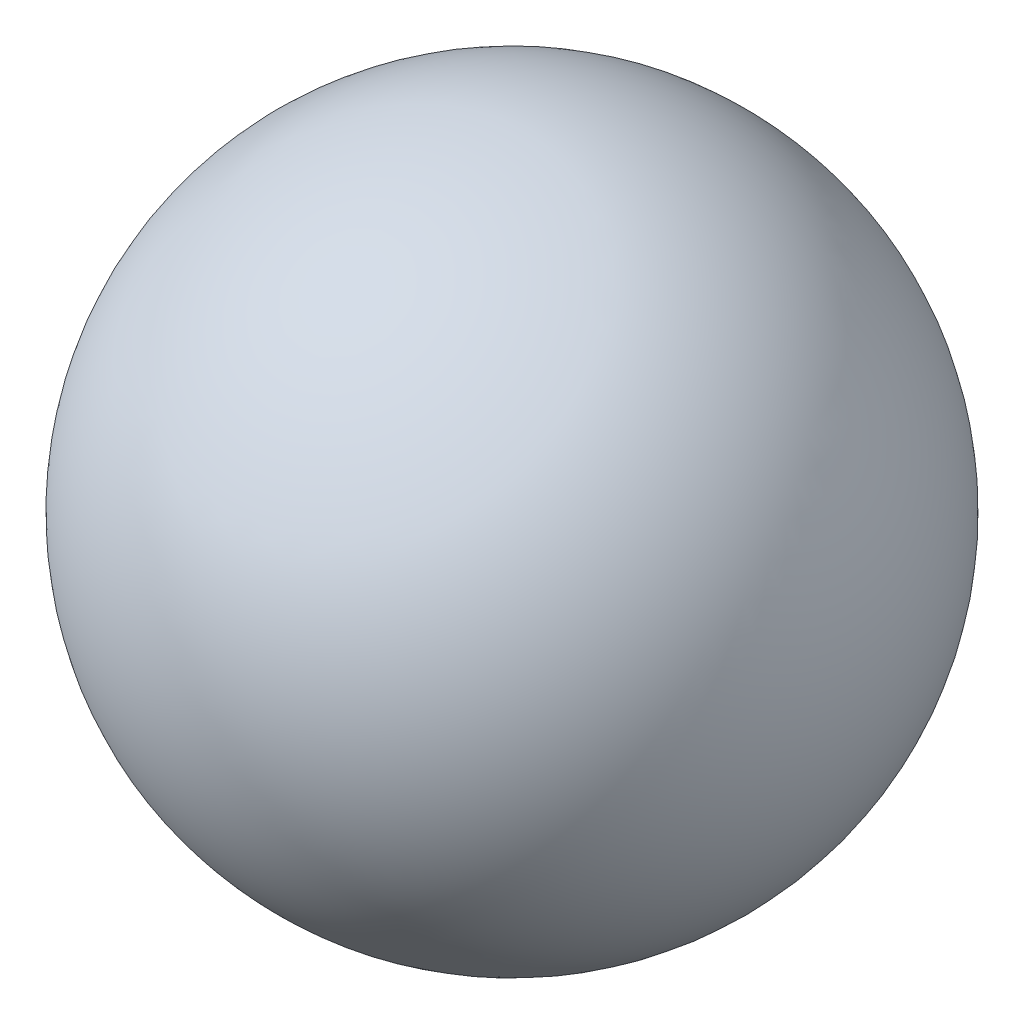
ISO-10303-21;
HEADER;
FILE_DESCRIPTION(('STEP AP214'),'2;1');
FILE_NAME('part.step','',(''),(''),'','','');
FILE_SCHEMA(('AUTOMOTIVE_DESIGN { 1 0 10303 214 1 1 1 1 }'));
ENDSEC;
DATA;
#1=APPLICATION_CONTEXT('core data for automotive mechanical design processes');
#2=APPLICATION_PROTOCOL_DEFINITION('international standard','automotive_design',2000,#1);
#3=PRODUCT_CONTEXT('',#1,'mechanical');
#4=PRODUCT('Part','Part','',(#3));
#5=PRODUCT_RELATED_PRODUCT_CATEGORY('part','',(#4));
#6=PRODUCT_DEFINITION_FORMATION('','',#4);
#7=PRODUCT_DEFINITION_CONTEXT('part definition',#1,'design');
#8=PRODUCT_DEFINITION('design','',#6,#7);
#9=PRODUCT_DEFINITION_SHAPE('','',#8);
#10=(LENGTH_UNIT() NAMED_UNIT(*) SI_UNIT(.MILLI.,.METRE.));
#11=(NAMED_UNIT(*) PLANE_ANGLE_UNIT() SI_UNIT($,.RADIAN.));
#12=(NAMED_UNIT(*) SI_UNIT($,.STERADIAN.) SOLID_ANGLE_UNIT());
#13=UNCERTAINTY_MEASURE_WITH_UNIT(LENGTH_MEASURE(1.E-05),#10,'distance_accuracy_value','');
#14=(GEOMETRIC_REPRESENTATION_CONTEXT(3) GLOBAL_UNCERTAINTY_ASSIGNED_CONTEXT((#13)) GLOBAL_UNIT_ASSIGNED_CONTEXT((#10,
#11,#12)) REPRESENTATION_CONTEXT('',''));
#15=CARTESIAN_POINT('',(0.,0.,0.));
#16=DIRECTION('',(0.,0.,1.));
#17=DIRECTION('',(1.,0.,0.));
#18=AXIS2_PLACEMENT_3D('',#15,#16,#17);
#19=CARTESIAN_POINT('',(1.984375,3.43703832126949,0.));
#20=DIRECTION('',(0.500000000000001,0.866025403784438,0.));
#21=DIRECTION('',(-0.866025403784438,0.500000000000001,0.));
#22=AXIS2_PLACEMENT_3D('',#19,#20,#21);
#23=SPHERICAL_SURFACE('',#22,0.758760243513404);
#24=CARTESIAN_POINT('',(2.36375512175671,4.09414396753376,0.));
#25=VERTEX_POINT('',#24);
#26=VERTEX_LOOP('',#25);
#27=FACE_BOUND('',#26,.T.);
#28=ADVANCED_FACE('F34',(#27),#23,.T.);
#29=CLOSED_SHELL('',(#28));
#30=MANIFOLD_SOLID_BREP('B2',#29);
#31=ADVANCED_BREP_SHAPE_REPRESENTATION('',(#18,#30),#14);
#32=SHAPE_DEFINITION_REPRESENTATION(#9,#31);
ENDSEC;
END-ISO-10303-21;
